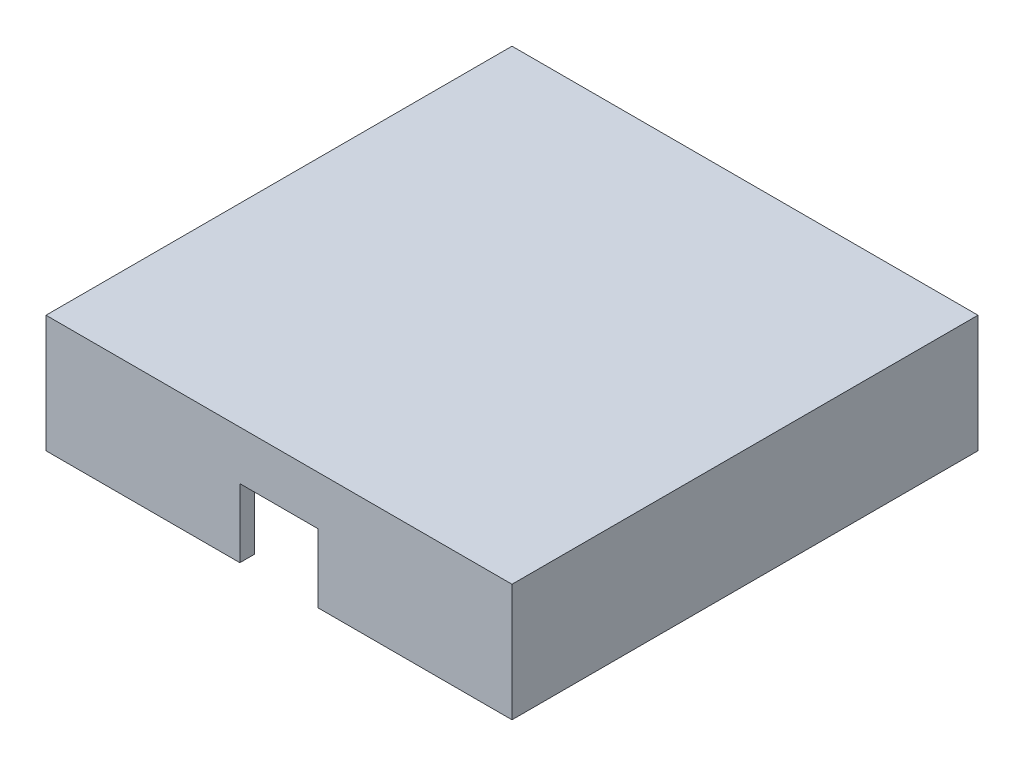
ISO-10303-21;
HEADER;
FILE_DESCRIPTION(('STEP AP214'),'2;1');
FILE_NAME('part.step','',(''),(''),'','','');
FILE_SCHEMA(('AUTOMOTIVE_DESIGN { 1 0 10303 214 1 1 1 1 }'));
ENDSEC;
DATA;
#1=APPLICATION_CONTEXT('core data for automotive mechanical design processes');
#2=APPLICATION_PROTOCOL_DEFINITION('international standard','automotive_design',2000,#1);
#3=PRODUCT_CONTEXT('',#1,'mechanical');
#4=PRODUCT('Part','Part','',(#3));
#5=PRODUCT_RELATED_PRODUCT_CATEGORY('part','',(#4));
#6=PRODUCT_DEFINITION_FORMATION('','',#4);
#7=PRODUCT_DEFINITION_CONTEXT('part definition',#1,'design');
#8=PRODUCT_DEFINITION('design','',#6,#7);
#9=PRODUCT_DEFINITION_SHAPE('','',#8);
#10=(LENGTH_UNIT() NAMED_UNIT(*) SI_UNIT(.MILLI.,.METRE.));
#11=(NAMED_UNIT(*) PLANE_ANGLE_UNIT() SI_UNIT($,.RADIAN.));
#12=(NAMED_UNIT(*) SI_UNIT($,.STERADIAN.) SOLID_ANGLE_UNIT());
#13=UNCERTAINTY_MEASURE_WITH_UNIT(LENGTH_MEASURE(1.E-05),#10,'distance_accuracy_value','');
#14=(GEOMETRIC_REPRESENTATION_CONTEXT(3) GLOBAL_UNCERTAINTY_ASSIGNED_CONTEXT((#13)) GLOBAL_UNIT_ASSIGNED_CONTEXT((#10,
#11,#12)) REPRESENTATION_CONTEXT('',''));
#15=CARTESIAN_POINT('',(0.,0.,0.));
#16=DIRECTION('',(0.,0.,1.));
#17=DIRECTION('',(1.,0.,0.));
#18=AXIS2_PLACEMENT_3D('',#15,#16,#17);
#19=CARTESIAN_POINT('',(0.,0.,0.));
#20=DIRECTION('',(0.,-1.,0.));
#21=DIRECTION('',(0.,0.,-1.));
#22=AXIS2_PLACEMENT_3D('',#19,#20,#21);
#23=PLANE('',#22);
#24=DIRECTION('',(0.,0.,1.));
#25=VECTOR('',#24,1.);
#26=CARTESIAN_POINT('',(46.125,0.,-46.125));
#27=LINE('',#26,#25);
#28=CARTESIAN_POINT('',(46.125,0.,-46.125));
#29=VERTEX_POINT('',#28);
#30=CARTESIAN_POINT('',(46.125,0.,-1.5));
#31=VERTEX_POINT('',#30);
#32=EDGE_CURVE('E63',#29,#31,#27,.T.);
#33=ORIENTED_EDGE('',*,*,#32,.T.);
#34=DIRECTION('',(-1.,0.,0.));
#35=VECTOR('',#34,1.);
#36=CARTESIAN_POINT('',(46.125,0.,-1.5));
#37=LINE('',#36,#35);
#38=CARTESIAN_POINT('',(1.5,0.,-1.5));
#39=VERTEX_POINT('',#38);
#40=EDGE_CURVE('E328',#31,#39,#37,.T.);
#41=ORIENTED_EDGE('',*,*,#40,.T.);
#42=DIRECTION('',(0.,0.,-1.));
#43=VECTOR('',#42,1.);
#44=CARTESIAN_POINT('',(1.5,0.,-1.5));
#45=LINE('',#44,#43);
#46=CARTESIAN_POINT('',(1.5,0.,-46.125));
#47=VERTEX_POINT('',#46);
#48=EDGE_CURVE('E331',#39,#47,#45,.T.);
#49=ORIENTED_EDGE('',*,*,#48,.T.);
#50=DIRECTION('',(1.,0.,0.));
#51=VECTOR('',#50,1.);
#52=CARTESIAN_POINT('',(1.5,0.,-46.125));
#53=LINE('',#52,#51);
#54=EDGE_CURVE('E313',#47,#29,#53,.T.);
#55=ORIENTED_EDGE('',*,*,#54,.T.);
#56=EDGE_LOOP('',(#33,#41,#49,#55));
#57=FACE_BOUND('',#56,.T.);
#58=DIRECTION('',(0.707106781186548,0.,-0.707106781186547));
#59=VECTOR('',#58,1.);
#60=CARTESIAN_POINT('',(15.6807720163547,0.,-28.4086940777126));
#61=LINE('',#60,#59);
#62=CARTESIAN_POINT('',(17.4485389693211,0.,-30.1764610306789));
#63=VERTEX_POINT('',#62);
#64=CARTESIAN_POINT('',(19.2163059222875,0.,-31.9442279836453));
#65=VERTEX_POINT('',#64);
#66=EDGE_CURVE('E216',#63,#65,#61,.T.);
#67=ORIENTED_EDGE('',*,*,#66,.F.);
#68=CARTESIAN_POINT('',(15.6807720163547,0.,-28.4086940777126));
#69=VERTEX_POINT('',#68);
#70=EDGE_CURVE('E232',#69,#63,#61,.T.);
#71=ORIENTED_EDGE('',*,*,#70,.F.);
#72=DIRECTION('',(-0.707106781186547,0.,-0.707106781186548));
#73=VECTOR('',#72,1.);
#74=CARTESIAN_POINT('',(15.6807720163547,0.,-28.4086940777126));
#75=LINE('',#74,#73);
#76=CARTESIAN_POINT('',(28.4086940777126,0.,-15.6807720163547));
#77=VERTEX_POINT('',#76);
#78=EDGE_CURVE('E222',#77,#69,#75,.T.);
#79=ORIENTED_EDGE('',*,*,#78,.F.);
#80=DIRECTION('',(-0.707106781186547,0.,0.707106781186547));
#81=VECTOR('',#80,1.);
#82=CARTESIAN_POINT('',(28.4086940777126,0.,-15.6807720163547));
#83=LINE('',#82,#81);
#84=CARTESIAN_POINT('',(30.1764610306789,0.,-17.4485389693211));
#85=VERTEX_POINT('',#84);
#86=EDGE_CURVE('E239',#85,#77,#83,.T.);
#87=ORIENTED_EDGE('',*,*,#86,.F.);
#88=CARTESIAN_POINT('',(31.9442279836453,0.,-19.2163059222874));
#89=VERTEX_POINT('',#88);
#90=EDGE_CURVE('E240',#89,#85,#83,.T.);
#91=ORIENTED_EDGE('',*,*,#90,.F.);
#92=DIRECTION('',(0.707106781186547,0.,0.707106781186548));
#93=VECTOR('',#92,1.);
#94=CARTESIAN_POINT('',(19.2163059222875,0.,-31.9442279836453));
#95=LINE('',#94,#93);
#96=EDGE_CURVE('E236',#65,#89,#95,.T.);
#97=ORIENTED_EDGE('',*,*,#96,.F.);
#98=EDGE_LOOP('',(#67,#71,#79,#87,#91,#97));
#99=FACE_BOUND('',#98,.T.);
#100=ADVANCED_FACE('F39',(#57,#99),#23,.T.);
#101=CARTESIAN_POINT('',(15.6807720163547,-4.,-28.4086940777126));
#102=DIRECTION('',(0.707106781186547,0.,0.707106781186548));
#103=DIRECTION('',(0.707106781186548,0.,-0.707106781186547));
#104=AXIS2_PLACEMENT_3D('',#101,#102,#103);
#105=PLANE('',#104);
#106=ORIENTED_EDGE('',*,*,#70,.T.);
#107=CARTESIAN_POINT('',(17.4485389693211,-1.5,-30.1764610306789));
#108=DIRECTION('',(0.707106781186547,0.,0.707106781186548));
#109=DIRECTION('',(0.707106781186548,0.,-0.707106781186547));
#110=AXIS2_PLACEMENT_3D('',#107,#108,#109);
#111=CIRCLE('',#110,1.50000000000001);
#112=EDGE_CURVE('E212',#63,#63,#111,.T.);
#113=ORIENTED_EDGE('',*,*,#112,.T.);
#114=ORIENTED_EDGE('',*,*,#66,.T.);
#115=DIRECTION('',(0.,1.,0.));
#116=VECTOR('',#115,1.);
#117=CARTESIAN_POINT('',(19.2163059222875,-4.,-31.9442279836453));
#118=LINE('',#117,#116);
#119=CARTESIAN_POINT('',(19.2163059222875,-4.,-31.9442279836453));
#120=VERTEX_POINT('',#119);
#121=EDGE_CURVE('E257',#120,#65,#118,.T.);
#122=ORIENTED_EDGE('',*,*,#121,.F.);
#123=DIRECTION('',(0.707106781186548,0.,-0.707106781186547));
#124=VECTOR('',#123,1.);
#125=CARTESIAN_POINT('',(15.6807720163547,-4.,-28.4086940777126));
#126=LINE('',#125,#124);
#127=CARTESIAN_POINT('',(15.6807720163547,-4.,-28.4086940777126));
#128=VERTEX_POINT('',#127);
#129=EDGE_CURVE('E217',#128,#120,#126,.T.);
#130=ORIENTED_EDGE('',*,*,#129,.F.);
#131=DIRECTION('',(0.,1.,0.));
#132=VECTOR('',#131,1.);
#133=CARTESIAN_POINT('',(15.6807720163547,-4.,-28.4086940777126));
#134=LINE('',#133,#132);
#135=EDGE_CURVE('E231',#128,#69,#134,.T.);
#136=ORIENTED_EDGE('',*,*,#135,.T.);
#137=EDGE_LOOP('',(#106,#113,#114,#122,#130,#136));
#138=FACE_BOUND('',#137,.T.);
#139=ADVANCED_FACE('F375',(#138),#105,.F.);
#140=CARTESIAN_POINT('',(19.2163059222875,-4.,-31.9442279836453));
#141=DIRECTION('',(-0.707106781186548,0.,0.707106781186547));
#142=DIRECTION('',(0.707106781186547,0.,0.707106781186548));
#143=AXIS2_PLACEMENT_3D('',#140,#141,#142);
#144=PLANE('',#143);
#145=ORIENTED_EDGE('',*,*,#96,.T.);
#146=DIRECTION('',(0.,1.,0.));
#147=VECTOR('',#146,1.);
#148=CARTESIAN_POINT('',(31.9442279836453,-4.,-19.2163059222874));
#149=LINE('',#148,#147);
#150=CARTESIAN_POINT('',(31.9442279836453,-4.,-19.2163059222874));
#151=VERTEX_POINT('',#150);
#152=EDGE_CURVE('E253',#151,#89,#149,.T.);
#153=ORIENTED_EDGE('',*,*,#152,.F.);
#154=DIRECTION('',(0.707106781186547,0.,0.707106781186548));
#155=VECTOR('',#154,1.);
#156=CARTESIAN_POINT('',(19.2163059222875,-4.,-31.9442279836453));
#157=LINE('',#156,#155);
#158=EDGE_CURVE('E221',#120,#151,#157,.T.);
#159=ORIENTED_EDGE('',*,*,#158,.F.);
#160=ORIENTED_EDGE('',*,*,#121,.T.);
#161=EDGE_LOOP('',(#145,#153,#159,#160));
#162=FACE_BOUND('',#161,.T.);
#163=ADVANCED_FACE('F382',(#162),#144,.F.);
#164=CARTESIAN_POINT('',(28.4086940777126,-4.,-15.6807720163547));
#165=DIRECTION('',(-0.707106781186547,0.,-0.707106781186547));
#166=DIRECTION('',(-0.707106781186548,0.,0.707106781186548));
#167=AXIS2_PLACEMENT_3D('',#164,#165,#166);
#168=PLANE('',#167);
#169=ORIENTED_EDGE('',*,*,#90,.T.);
#170=CARTESIAN_POINT('',(30.1764610306789,-1.5,-17.4485389693211));
#171=DIRECTION('',(0.707106781186548,0.,0.707106781186547));
#172=DIRECTION('',(0.707106781186547,0.,-0.707106781186548));
#173=AXIS2_PLACEMENT_3D('',#170,#171,#172);
#174=CIRCLE('',#173,1.50000000000001);
#175=EDGE_CURVE('E209',#85,#85,#174,.T.);
#176=ORIENTED_EDGE('',*,*,#175,.F.);
#177=ORIENTED_EDGE('',*,*,#86,.T.);
#178=DIRECTION('',(0.,1.,0.));
#179=VECTOR('',#178,1.);
#180=CARTESIAN_POINT('',(28.4086940777126,-4.,-15.6807720163547));
#181=LINE('',#180,#179);
#182=CARTESIAN_POINT('',(28.4086940777126,-4.,-15.6807720163547));
#183=VERTEX_POINT('',#182);
#184=EDGE_CURVE('E249',#183,#77,#181,.T.);
#185=ORIENTED_EDGE('',*,*,#184,.F.);
#186=DIRECTION('',(-0.707106781186547,0.,0.707106781186547));
#187=VECTOR('',#186,1.);
#188=CARTESIAN_POINT('',(28.4086940777126,-4.,-15.6807720163547));
#189=LINE('',#188,#187);
#190=EDGE_CURVE('E225',#151,#183,#189,.T.);
#191=ORIENTED_EDGE('',*,*,#190,.F.);
#192=ORIENTED_EDGE('',*,*,#152,.T.);
#193=EDGE_LOOP('',(#169,#176,#177,#185,#191,#192));
#194=FACE_BOUND('',#193,.T.);
#195=ADVANCED_FACE('F431',(#194),#168,.F.);
#196=CARTESIAN_POINT('',(15.6807720163547,-4.,-28.4086940777126));
#197=DIRECTION('',(0.707106781186548,0.,-0.707106781186547));
#198=DIRECTION('',(-0.707106781186547,0.,-0.707106781186548));
#199=AXIS2_PLACEMENT_3D('',#196,#197,#198);
#200=PLANE('',#199);
#201=ORIENTED_EDGE('',*,*,#78,.T.);
#202=ORIENTED_EDGE('',*,*,#135,.F.);
#203=DIRECTION('',(-0.707106781186547,0.,-0.707106781186548));
#204=VECTOR('',#203,1.);
#205=CARTESIAN_POINT('',(15.6807720163547,-4.,-28.4086940777126));
#206=LINE('',#205,#204);
#207=EDGE_CURVE('E228',#183,#128,#206,.T.);
#208=ORIENTED_EDGE('',*,*,#207,.F.);
#209=ORIENTED_EDGE('',*,*,#184,.T.);
#210=EDGE_LOOP('',(#201,#202,#208,#209));
#211=FACE_BOUND('',#210,.T.);
#212=ADVANCED_FACE('F427',(#211),#200,.F.);
#213=CARTESIAN_POINT('',(0.,-4.,0.));
#214=DIRECTION('',(0.,-1.,0.));
#215=DIRECTION('',(0.,0.,-1.));
#216=AXIS2_PLACEMENT_3D('',#213,#214,#215);
#217=PLANE('',#216);
#218=ORIENTED_EDGE('',*,*,#129,.T.);
#219=ORIENTED_EDGE('',*,*,#158,.T.);
#220=ORIENTED_EDGE('',*,*,#190,.T.);
#221=ORIENTED_EDGE('',*,*,#207,.T.);
#222=EDGE_LOOP('',(#218,#219,#220,#221));
#223=FACE_BOUND('',#222,.T.);
#224=ADVANCED_FACE('F423',(#223),#217,.T.);
#225=CARTESIAN_POINT('',(0.,-1.5,-47.625));
#226=DIRECTION('',(0.707106781186548,0.,0.707106781186547));
#227=DIRECTION('',(0.707106781186547,0.,-0.707106781186548));
#228=AXIS2_PLACEMENT_3D('',#225,#226,#227);
#229=CYLINDRICAL_SURFACE('',#228,1.50000000000001);
#230=ORIENTED_EDGE('',*,*,#175,.T.);
#231=EDGE_LOOP('',(#230));
#232=FACE_BOUND('',#231,.T.);
#233=ORIENTED_EDGE('',*,*,#112,.F.);
#234=EDGE_LOOP('',(#233));
#235=FACE_BOUND('',#234,.T.);
#236=ADVANCED_FACE('F420',(#232,#235),#229,.F.);
#237=CARTESIAN_POINT('',(0.,-10.,0.));
#238=DIRECTION('',(0.,-1.,0.));
#239=DIRECTION('',(0.,0.,-1.));
#240=AXIS2_PLACEMENT_3D('',#237,#238,#239);
#241=PLANE('',#240);
#242=DIRECTION('',(0.,0.,1.));
#243=VECTOR('',#242,1.);
#244=CARTESIAN_POINT('',(19.8125,-10.,-2.));
#245=LINE('',#244,#243);
#246=CARTESIAN_POINT('',(19.8125,-10.,-1.5));
#247=VERTEX_POINT('',#246);
#248=CARTESIAN_POINT('',(19.8125,-10.,0.));
#249=VERTEX_POINT('',#248);
#250=EDGE_CURVE('E162',#247,#249,#245,.T.);
#251=ORIENTED_EDGE('',*,*,#250,.T.);
#252=DIRECTION('',(-1.,0.,0.));
#253=VECTOR('',#252,1.);
#254=CARTESIAN_POINT('',(47.625,-10.,0.));
#255=LINE('',#254,#253);
#256=CARTESIAN_POINT('',(0.,-10.,0.));
#257=VERTEX_POINT('',#256);
#258=EDGE_CURVE('E177',#249,#257,#255,.T.);
#259=ORIENTED_EDGE('',*,*,#258,.T.);
#260=DIRECTION('',(0.,0.,-1.));
#261=VECTOR('',#260,1.);
#262=CARTESIAN_POINT('',(0.,-10.,0.));
#263=LINE('',#262,#261);
#264=CARTESIAN_POINT('',(0.,-10.,-47.625));
#265=VERTEX_POINT('',#264);
#266=EDGE_CURVE('E193',#257,#265,#263,.T.);
#267=ORIENTED_EDGE('',*,*,#266,.T.);
#268=DIRECTION('',(1.,0.,0.));
#269=VECTOR('',#268,1.);
#270=CARTESIAN_POINT('',(0.,-10.,-47.625));
#271=LINE('',#270,#269);
#272=CARTESIAN_POINT('',(47.625,-10.,-47.625));
#273=VERTEX_POINT('',#272);
#274=EDGE_CURVE('E201',#265,#273,#271,.T.);
#275=ORIENTED_EDGE('',*,*,#274,.T.);
#276=DIRECTION('',(0.,0.,1.));
#277=VECTOR('',#276,1.);
#278=CARTESIAN_POINT('',(47.625,-10.,-47.625));
#279=LINE('',#278,#277);
#280=CARTESIAN_POINT('',(47.625,-10.,0.));
#281=VERTEX_POINT('',#280);
#282=EDGE_CURVE('E205',#273,#281,#279,.T.);
#283=ORIENTED_EDGE('',*,*,#282,.T.);
#284=CARTESIAN_POINT('',(27.8125,-10.,0.));
#285=VERTEX_POINT('',#284);
#286=EDGE_CURVE('E187',#281,#285,#255,.T.);
#287=ORIENTED_EDGE('',*,*,#286,.T.);
#288=DIRECTION('',(0.,0.,1.));
#289=VECTOR('',#288,1.);
#290=CARTESIAN_POINT('',(27.8125,-10.,-2.));
#291=LINE('',#290,#289);
#292=CARTESIAN_POINT('',(27.8125,-10.,-1.5));
#293=VERTEX_POINT('',#292);
#294=EDGE_CURVE('E55',#293,#285,#291,.T.);
#295=ORIENTED_EDGE('',*,*,#294,.F.);
#296=DIRECTION('',(-1.,0.,0.));
#297=VECTOR('',#296,1.);
#298=CARTESIAN_POINT('',(46.125,-10.,-1.5));
#299=LINE('',#298,#297);
#300=CARTESIAN_POINT('',(46.125,-10.,-1.5));
#301=VERTEX_POINT('',#300);
#302=EDGE_CURVE('E314',#301,#293,#299,.T.);
#303=ORIENTED_EDGE('',*,*,#302,.F.);
#304=DIRECTION('',(0.,0.,1.));
#305=VECTOR('',#304,1.);
#306=CARTESIAN_POINT('',(46.125,-10.,-46.125));
#307=LINE('',#306,#305);
#308=CARTESIAN_POINT('',(46.125,-10.,-46.125));
#309=VERTEX_POINT('',#308);
#310=EDGE_CURVE('E310',#309,#301,#307,.T.);
#311=ORIENTED_EDGE('',*,*,#310,.F.);
#312=DIRECTION('',(1.,0.,0.));
#313=VECTOR('',#312,1.);
#314=CARTESIAN_POINT('',(1.5,-10.,-46.125));
#315=LINE('',#314,#313);
#316=CARTESIAN_POINT('',(1.5,-10.,-46.125));
#317=VERTEX_POINT('',#316);
#318=EDGE_CURVE('E322',#317,#309,#315,.T.);
#319=ORIENTED_EDGE('',*,*,#318,.F.);
#320=DIRECTION('',(0.,0.,-1.));
#321=VECTOR('',#320,1.);
#322=CARTESIAN_POINT('',(1.5,-10.,-1.5));
#323=LINE('',#322,#321);
#324=CARTESIAN_POINT('',(1.5,-10.,-1.5));
#325=VERTEX_POINT('',#324);
#326=EDGE_CURVE('E318',#325,#317,#323,.T.);
#327=ORIENTED_EDGE('',*,*,#326,.F.);
#328=EDGE_CURVE('E179',#247,#325,#299,.T.);
#329=ORIENTED_EDGE('',*,*,#328,.F.);
#330=EDGE_LOOP('',(#251,#259,#267,#275,#283,#287,#295,#303,#311,#319,#327,#329));
#331=FACE_BOUND('',#330,.T.);
#332=ADVANCED_FACE('F175',(#331),#241,.T.);
#333=CARTESIAN_POINT('',(46.125,-10.,-46.125));
#334=DIRECTION('',(-1.,0.,0.));
#335=DIRECTION('',(0.,0.,1.));
#336=AXIS2_PLACEMENT_3D('',#333,#334,#335);
#337=PLANE('',#336);
#338=ORIENTED_EDGE('',*,*,#32,.F.);
#339=DIRECTION('',(0.,1.,0.));
#340=VECTOR('',#339,1.);
#341=CARTESIAN_POINT('',(46.125,-10.,-46.125));
#342=LINE('',#341,#340);
#343=EDGE_CURVE('E325',#309,#29,#342,.T.);
#344=ORIENTED_EDGE('',*,*,#343,.F.);
#345=ORIENTED_EDGE('',*,*,#310,.T.);
#346=DIRECTION('',(0.,1.,0.));
#347=VECTOR('',#346,1.);
#348=CARTESIAN_POINT('',(46.125,-10.,-1.5));
#349=LINE('',#348,#347);
#350=EDGE_CURVE('E188',#301,#31,#349,.T.);
#351=ORIENTED_EDGE('',*,*,#350,.T.);
#352=EDGE_LOOP('',(#338,#344,#345,#351));
#353=FACE_BOUND('',#352,.T.);
#354=ADVANCED_FACE('F356',(#353),#337,.T.);
#355=CARTESIAN_POINT('',(46.125,-10.,-1.5));
#356=DIRECTION('',(0.,0.,-1.));
#357=DIRECTION('',(-1.,0.,0.));
#358=AXIS2_PLACEMENT_3D('',#355,#356,#357);
#359=PLANE('',#358);
#360=DIRECTION('',(0.,1.,0.));
#361=VECTOR('',#360,1.);
#362=CARTESIAN_POINT('',(19.8125,-9.99999999999999,-1.5));
#363=LINE('',#362,#361);
#364=CARTESIAN_POINT('',(19.8125,-3.,-1.5));
#365=VERTEX_POINT('',#364);
#366=EDGE_CURVE('E307',#247,#365,#363,.T.);
#367=ORIENTED_EDGE('',*,*,#366,.F.);
#368=ORIENTED_EDGE('',*,*,#328,.T.);
#369=DIRECTION('',(0.,1.,0.));
#370=VECTOR('',#369,1.);
#371=CARTESIAN_POINT('',(1.5,-10.,-1.5));
#372=LINE('',#371,#370);
#373=EDGE_CURVE('E195',#325,#39,#372,.T.);
#374=ORIENTED_EDGE('',*,*,#373,.T.);
#375=ORIENTED_EDGE('',*,*,#40,.F.);
#376=ORIENTED_EDGE('',*,*,#350,.F.);
#377=ORIENTED_EDGE('',*,*,#302,.T.);
#378=DIRECTION('',(0.,-1.,0.));
#379=VECTOR('',#378,1.);
#380=CARTESIAN_POINT('',(27.8125,-10.,-1.5));
#381=LINE('',#380,#379);
#382=CARTESIAN_POINT('',(27.8125,-3.,-1.5));
#383=VERTEX_POINT('',#382);
#384=EDGE_CURVE('E296',#383,#293,#381,.T.);
#385=ORIENTED_EDGE('',*,*,#384,.F.);
#386=DIRECTION('',(1.,0.,0.));
#387=VECTOR('',#386,1.);
#388=CARTESIAN_POINT('',(46.125,-3.,-1.5));
#389=LINE('',#388,#387);
#390=EDGE_CURVE('E304',#365,#383,#389,.T.);
#391=ORIENTED_EDGE('',*,*,#390,.F.);
#392=EDGE_LOOP('',(#367,#368,#374,#375,#376,#377,#385,#391));
#393=FACE_BOUND('',#392,.T.);
#394=ADVANCED_FACE('F347',(#393),#359,.T.);
#395=CARTESIAN_POINT('',(1.5,-10.,-1.5));
#396=DIRECTION('',(1.,0.,0.));
#397=DIRECTION('',(0.,0.,-1.));
#398=AXIS2_PLACEMENT_3D('',#395,#396,#397);
#399=PLANE('',#398);
#400=ORIENTED_EDGE('',*,*,#48,.F.);
#401=ORIENTED_EDGE('',*,*,#373,.F.);
#402=ORIENTED_EDGE('',*,*,#326,.T.);
#403=DIRECTION('',(0.,1.,0.));
#404=VECTOR('',#403,1.);
#405=CARTESIAN_POINT('',(1.5,-10.,-46.125));
#406=LINE('',#405,#404);
#407=EDGE_CURVE('E339',#317,#47,#406,.T.);
#408=ORIENTED_EDGE('',*,*,#407,.T.);
#409=EDGE_LOOP('',(#400,#401,#402,#408));
#410=FACE_BOUND('',#409,.T.);
#411=ADVANCED_FACE('F350',(#410),#399,.T.);
#412=CARTESIAN_POINT('',(1.5,-10.,-46.125));
#413=DIRECTION('',(0.,0.,1.));
#414=DIRECTION('',(1.,0.,0.));
#415=AXIS2_PLACEMENT_3D('',#412,#413,#414);
#416=PLANE('',#415);
#417=ORIENTED_EDGE('',*,*,#54,.F.);
#418=ORIENTED_EDGE('',*,*,#407,.F.);
#419=ORIENTED_EDGE('',*,*,#318,.T.);
#420=ORIENTED_EDGE('',*,*,#343,.T.);
#421=EDGE_LOOP('',(#417,#418,#419,#420));
#422=FACE_BOUND('',#421,.T.);
#423=ADVANCED_FACE('F358',(#422),#416,.T.);
#424=CARTESIAN_POINT('',(0.,2.,0.));
#425=DIRECTION('',(0.,-1.,0.));
#426=DIRECTION('',(0.,0.,-1.));
#427=AXIS2_PLACEMENT_3D('',#424,#425,#426);
#428=PLANE('',#427);
#429=DIRECTION('',(0.,0.,1.));
#430=VECTOR('',#429,1.);
#431=CARTESIAN_POINT('',(0.,2.,0.));
#432=LINE('',#431,#430);
#433=CARTESIAN_POINT('',(0.,2.,-47.625));
#434=VERTEX_POINT('',#433);
#435=CARTESIAN_POINT('',(0.,2.,0.));
#436=VERTEX_POINT('',#435);
#437=EDGE_CURVE('E261',#434,#436,#432,.T.);
#438=ORIENTED_EDGE('',*,*,#437,.T.);
#439=DIRECTION('',(1.,0.,0.));
#440=VECTOR('',#439,1.);
#441=CARTESIAN_POINT('',(0.,2.,0.));
#442=LINE('',#441,#440);
#443=CARTESIAN_POINT('',(47.625,2.,0.));
#444=VERTEX_POINT('',#443);
#445=EDGE_CURVE('E265',#436,#444,#442,.T.);
#446=ORIENTED_EDGE('',*,*,#445,.T.);
#447=DIRECTION('',(0.,0.,-1.));
#448=VECTOR('',#447,1.);
#449=CARTESIAN_POINT('',(47.625,2.,0.));
#450=LINE('',#449,#448);
#451=CARTESIAN_POINT('',(47.625,2.,-47.625));
#452=VERTEX_POINT('',#451);
#453=EDGE_CURVE('E268',#444,#452,#450,.T.);
#454=ORIENTED_EDGE('',*,*,#453,.T.);
#455=DIRECTION('',(-1.,0.,0.));
#456=VECTOR('',#455,1.);
#457=CARTESIAN_POINT('',(0.,2.,-47.625));
#458=LINE('',#457,#456);
#459=EDGE_CURVE('E271',#452,#434,#458,.T.);
#460=ORIENTED_EDGE('',*,*,#459,.T.);
#461=EDGE_LOOP('',(#438,#446,#454,#460));
#462=FACE_BOUND('',#461,.T.);
#463=ADVANCED_FACE('F387',(#462),#428,.F.);
#464=CARTESIAN_POINT('',(0.,2.,-47.625));
#465=DIRECTION('',(0.,0.,1.));
#466=DIRECTION('',(1.,0.,0.));
#467=AXIS2_PLACEMENT_3D('',#464,#465,#466);
#468=PLANE('',#467);
#469=DIRECTION('',(0.,-1.,0.));
#470=VECTOR('',#469,1.);
#471=CARTESIAN_POINT('',(47.625,2.,-47.625));
#472=LINE('',#471,#470);
#473=EDGE_CURVE('E277',#452,#273,#472,.T.);
#474=ORIENTED_EDGE('',*,*,#473,.T.);
#475=ORIENTED_EDGE('',*,*,#274,.F.);
#476=DIRECTION('',(0.,-1.,0.));
#477=VECTOR('',#476,1.);
#478=CARTESIAN_POINT('',(0.,2.,-47.625));
#479=LINE('',#478,#477);
#480=EDGE_CURVE('E274',#434,#265,#479,.T.);
#481=ORIENTED_EDGE('',*,*,#480,.F.);
#482=ORIENTED_EDGE('',*,*,#459,.F.);
#483=EDGE_LOOP('',(#474,#475,#481,#482));
#484=FACE_BOUND('',#483,.T.);
#485=ADVANCED_FACE('F388',(#484),#468,.F.);
#486=CARTESIAN_POINT('',(47.625,2.,0.));
#487=DIRECTION('',(-1.,0.,0.));
#488=DIRECTION('',(0.,0.,1.));
#489=AXIS2_PLACEMENT_3D('',#486,#487,#488);
#490=PLANE('',#489);
#491=DIRECTION('',(0.,-1.,0.));
#492=VECTOR('',#491,1.);
#493=CARTESIAN_POINT('',(47.625,2.,0.));
#494=LINE('',#493,#492);
#495=EDGE_CURVE('E48',#444,#281,#494,.T.);
#496=ORIENTED_EDGE('',*,*,#495,.T.);
#497=ORIENTED_EDGE('',*,*,#282,.F.);
#498=ORIENTED_EDGE('',*,*,#473,.F.);
#499=ORIENTED_EDGE('',*,*,#453,.F.);
#500=EDGE_LOOP('',(#496,#497,#498,#499));
#501=FACE_BOUND('',#500,.T.);
#502=ADVANCED_FACE('F284',(#501),#490,.F.);
#503=CARTESIAN_POINT('',(0.,2.,0.));
#504=DIRECTION('',(0.,0.,-1.));
#505=DIRECTION('',(-1.,0.,0.));
#506=AXIS2_PLACEMENT_3D('',#503,#504,#505);
#507=PLANE('',#506);
#508=ORIENTED_EDGE('',*,*,#258,.F.);
#509=DIRECTION('',(0.,-1.,0.));
#510=VECTOR('',#509,1.);
#511=CARTESIAN_POINT('',(19.8125,-10.,0.));
#512=LINE('',#511,#510);
#513=CARTESIAN_POINT('',(19.8125,-3.,0.));
#514=VERTEX_POINT('',#513);
#515=EDGE_CURVE('E159',#514,#249,#512,.T.);
#516=ORIENTED_EDGE('',*,*,#515,.F.);
#517=DIRECTION('',(-1.,0.,0.));
#518=VECTOR('',#517,1.);
#519=CARTESIAN_POINT('',(19.8125,-3.,0.));
#520=LINE('',#519,#518);
#521=CARTESIAN_POINT('',(27.8125,-3.,0.));
#522=VERTEX_POINT('',#521);
#523=EDGE_CURVE('E181',#522,#514,#520,.T.);
#524=ORIENTED_EDGE('',*,*,#523,.F.);
#525=DIRECTION('',(0.,1.,0.));
#526=VECTOR('',#525,1.);
#527=CARTESIAN_POINT('',(27.8125,-10.,0.));
#528=LINE('',#527,#526);
#529=EDGE_CURVE('E171',#285,#522,#528,.T.);
#530=ORIENTED_EDGE('',*,*,#529,.F.);
#531=ORIENTED_EDGE('',*,*,#286,.F.);
#532=ORIENTED_EDGE('',*,*,#495,.F.);
#533=ORIENTED_EDGE('',*,*,#445,.F.);
#534=DIRECTION('',(0.,-1.,0.));
#535=VECTOR('',#534,1.);
#536=CARTESIAN_POINT('',(0.,2.,0.));
#537=LINE('',#536,#535);
#538=EDGE_CURVE('E11',#436,#257,#537,.T.);
#539=ORIENTED_EDGE('',*,*,#538,.T.);
#540=EDGE_LOOP('',(#508,#516,#524,#530,#531,#532,#533,#539));
#541=FACE_BOUND('',#540,.T.);
#542=ADVANCED_FACE('F183',(#541),#507,.F.);
#543=CARTESIAN_POINT('',(0.,2.,0.));
#544=DIRECTION('',(1.,0.,0.));
#545=DIRECTION('',(0.,0.,-1.));
#546=AXIS2_PLACEMENT_3D('',#543,#544,#545);
#547=PLANE('',#546);
#548=ORIENTED_EDGE('',*,*,#480,.T.);
#549=ORIENTED_EDGE('',*,*,#266,.F.);
#550=ORIENTED_EDGE('',*,*,#538,.F.);
#551=ORIENTED_EDGE('',*,*,#437,.F.);
#552=EDGE_LOOP('',(#548,#549,#550,#551));
#553=FACE_BOUND('',#552,.T.);
#554=ADVANCED_FACE('F41',(#553),#547,.F.);
#555=CARTESIAN_POINT('',(19.8125,-10.,-2.));
#556=DIRECTION('',(-1.,0.,0.));
#557=DIRECTION('',(0.,-1.,0.));
#558=AXIS2_PLACEMENT_3D('',#555,#556,#557);
#559=PLANE('',#558);
#560=ORIENTED_EDGE('',*,*,#366,.T.);
#561=DIRECTION('',(0.,0.,1.));
#562=VECTOR('',#561,1.);
#563=CARTESIAN_POINT('',(19.8125,-3.,-2.));
#564=LINE('',#563,#562);
#565=EDGE_CURVE('E165',#365,#514,#564,.T.);
#566=ORIENTED_EDGE('',*,*,#565,.T.);
#567=ORIENTED_EDGE('',*,*,#515,.T.);
#568=ORIENTED_EDGE('',*,*,#250,.F.);
#569=EDGE_LOOP('',(#560,#566,#567,#568));
#570=FACE_BOUND('',#569,.T.);
#571=ADVANCED_FACE('F161',(#570),#559,.F.);
#572=CARTESIAN_POINT('',(19.8125,-3.,-2.));
#573=DIRECTION('',(0.,1.,0.));
#574=DIRECTION('',(-1.,0.,0.));
#575=AXIS2_PLACEMENT_3D('',#572,#573,#574);
#576=PLANE('',#575);
#577=ORIENTED_EDGE('',*,*,#390,.T.);
#578=DIRECTION('',(0.,0.,1.));
#579=VECTOR('',#578,1.);
#580=CARTESIAN_POINT('',(27.8125,-3.,-2.));
#581=LINE('',#580,#579);
#582=EDGE_CURVE('E297',#383,#522,#581,.T.);
#583=ORIENTED_EDGE('',*,*,#582,.T.);
#584=ORIENTED_EDGE('',*,*,#523,.T.);
#585=ORIENTED_EDGE('',*,*,#565,.F.);
#586=EDGE_LOOP('',(#577,#583,#584,#585));
#587=FACE_BOUND('',#586,.T.);
#588=ADVANCED_FACE('F365',(#587),#576,.F.);
#589=CARTESIAN_POINT('',(27.8125,-10.,-2.));
#590=DIRECTION('',(1.,0.,0.));
#591=DIRECTION('',(0.,1.,0.));
#592=AXIS2_PLACEMENT_3D('',#589,#590,#591);
#593=PLANE('',#592);
#594=ORIENTED_EDGE('',*,*,#384,.T.);
#595=ORIENTED_EDGE('',*,*,#294,.T.);
#596=ORIENTED_EDGE('',*,*,#529,.T.);
#597=ORIENTED_EDGE('',*,*,#582,.F.);
#598=EDGE_LOOP('',(#594,#595,#596,#597));
#599=FACE_BOUND('',#598,.T.);
#600=ADVANCED_FACE('F363',(#599),#593,.F.);
#601=CLOSED_SHELL('',(#100,#139,#163,#195,#212,#224,#236,#332,#354,#394,#411,#423,#463,#485,
#502,#542,#554,#571,#588,#600));
#602=MANIFOLD_SOLID_BREP('B2',#601);
#603=ADVANCED_BREP_SHAPE_REPRESENTATION('',(#18,#602),#14);
#604=SHAPE_DEFINITION_REPRESENTATION(#9,#603);
ENDSEC;
END-ISO-10303-21;
